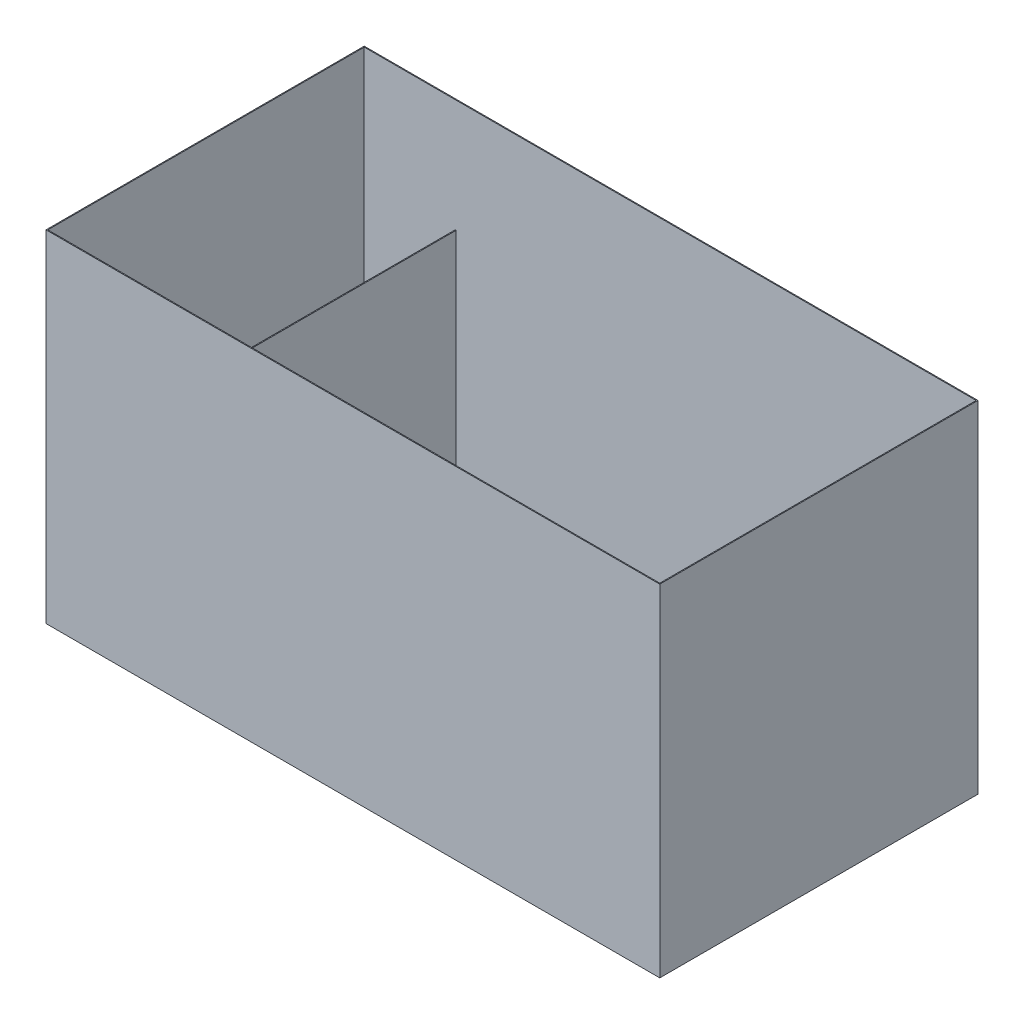
ISO-10303-21;
HEADER;
FILE_DESCRIPTION(('STEP AP214'),'2;1');
FILE_NAME('part.step','',(''),(''),'','','');
FILE_SCHEMA(('AUTOMOTIVE_DESIGN { 1 0 10303 214 1 1 1 1 }'));
ENDSEC;
DATA;
#1=APPLICATION_CONTEXT('core data for automotive mechanical design processes');
#2=APPLICATION_PROTOCOL_DEFINITION('international standard','automotive_design',2000,#1);
#3=PRODUCT_CONTEXT('',#1,'mechanical');
#4=PRODUCT('Part','Part','',(#3));
#5=PRODUCT_RELATED_PRODUCT_CATEGORY('part','',(#4));
#6=PRODUCT_DEFINITION_FORMATION('','',#4);
#7=PRODUCT_DEFINITION_CONTEXT('part definition',#1,'design');
#8=PRODUCT_DEFINITION('design','',#6,#7);
#9=PRODUCT_DEFINITION_SHAPE('','',#8);
#10=(LENGTH_UNIT() NAMED_UNIT(*) SI_UNIT(.MILLI.,.METRE.));
#11=(NAMED_UNIT(*) PLANE_ANGLE_UNIT() SI_UNIT($,.RADIAN.));
#12=(NAMED_UNIT(*) SI_UNIT($,.STERADIAN.) SOLID_ANGLE_UNIT());
#13=UNCERTAINTY_MEASURE_WITH_UNIT(LENGTH_MEASURE(1.E-05),#10,'distance_accuracy_value','');
#14=(GEOMETRIC_REPRESENTATION_CONTEXT(3) GLOBAL_UNCERTAINTY_ASSIGNED_CONTEXT((#13)) GLOBAL_UNIT_ASSIGNED_CONTEXT((#10,
#11,#12)) REPRESENTATION_CONTEXT('',''));
#15=CARTESIAN_POINT('',(0.,0.,0.));
#16=DIRECTION('',(0.,0.,1.));
#17=DIRECTION('',(1.,0.,0.));
#18=AXIS2_PLACEMENT_3D('',#15,#16,#17);
#19=CARTESIAN_POINT('',(252.,100.,-50.));
#20=DIRECTION('',(0.,0.,-1.));
#21=DIRECTION('',(-1.,0.,0.));
#22=AXIS2_PLACEMENT_3D('',#19,#20,#21);
#23=PLANE('',#22);
#24=DIRECTION('',(0.,-1.,0.));
#25=VECTOR('',#24,1.);
#26=CARTESIAN_POINT('',(250.,100.,-50.));
#27=LINE('',#26,#25);
#28=CARTESIAN_POINT('',(250.,550.,-50.));
#29=VERTEX_POINT('',#28);
#30=CARTESIAN_POINT('',(250.,100.,-50.));
#31=VERTEX_POINT('',#30);
#32=EDGE_CURVE('E116',#29,#31,#27,.T.);
#33=ORIENTED_EDGE('',*,*,#32,.T.);
#34=DIRECTION('',(-1.,0.,0.));
#35=VECTOR('',#34,1.);
#36=CARTESIAN_POINT('',(252.,100.,-50.));
#37=LINE('',#36,#35);
#38=CARTESIAN_POINT('',(252.,100.,-50.));
#39=VERTEX_POINT('',#38);
#40=EDGE_CURVE('E12',#39,#31,#37,.T.);
#41=ORIENTED_EDGE('',*,*,#40,.F.);
#42=DIRECTION('',(0.,-1.,0.));
#43=VECTOR('',#42,1.);
#44=CARTESIAN_POINT('',(252.,100.,-50.));
#45=LINE('',#44,#43);
#46=CARTESIAN_POINT('',(252.,550.,-50.));
#47=VERTEX_POINT('',#46);
#48=EDGE_CURVE('E102',#47,#39,#45,.T.);
#49=ORIENTED_EDGE('',*,*,#48,.F.);
#50=DIRECTION('',(-1.,0.,0.));
#51=VECTOR('',#50,1.);
#52=CARTESIAN_POINT('',(252.,550.,-50.));
#53=LINE('',#52,#51);
#54=EDGE_CURVE('E115',#47,#29,#53,.T.);
#55=ORIENTED_EDGE('',*,*,#54,.T.);
#56=EDGE_LOOP('',(#33,#41,#49,#55));
#57=FACE_BOUND('',#56,.T.);
#58=ADVANCED_FACE('F52',(#57),#23,.F.);
#59=CARTESIAN_POINT('',(252.,100.,-50.));
#60=DIRECTION('',(0.,1.,0.));
#61=DIRECTION('',(0.,0.,1.));
#62=AXIS2_PLACEMENT_3D('',#59,#60,#61);
#63=PLANE('',#62);
#64=DIRECTION('',(0.,0.,-1.));
#65=VECTOR('',#64,1.);
#66=CARTESIAN_POINT('',(250.,100.,-50.));
#67=LINE('',#66,#65);
#68=CARTESIAN_POINT('',(250.,100.,-650.));
#69=VERTEX_POINT('',#68);
#70=EDGE_CURVE('E107',#31,#69,#67,.T.);
#71=ORIENTED_EDGE('',*,*,#70,.T.);
#72=DIRECTION('',(-1.,0.,0.));
#73=VECTOR('',#72,1.);
#74=CARTESIAN_POINT('',(252.,100.,-650.));
#75=LINE('',#74,#73);
#76=CARTESIAN_POINT('',(252.,100.,-650.));
#77=VERTEX_POINT('',#76);
#78=EDGE_CURVE('E61',#77,#69,#75,.T.);
#79=ORIENTED_EDGE('',*,*,#78,.F.);
#80=DIRECTION('',(0.,0.,-1.));
#81=VECTOR('',#80,1.);
#82=CARTESIAN_POINT('',(252.,100.,-50.));
#83=LINE('',#82,#81);
#84=EDGE_CURVE('E97',#39,#77,#83,.T.);
#85=ORIENTED_EDGE('',*,*,#84,.F.);
#86=ORIENTED_EDGE('',*,*,#40,.T.);
#87=EDGE_LOOP('',(#71,#79,#85,#86));
#88=FACE_BOUND('',#87,.T.);
#89=ADVANCED_FACE('F110',(#88),#63,.F.);
#90=CARTESIAN_POINT('',(252.,100.,-650.));
#91=DIRECTION('',(0.,0.,1.));
#92=DIRECTION('',(1.,0.,0.));
#93=AXIS2_PLACEMENT_3D('',#90,#91,#92);
#94=PLANE('',#93);
#95=DIRECTION('',(0.,1.,0.));
#96=VECTOR('',#95,1.);
#97=CARTESIAN_POINT('',(250.,100.,-650.));
#98=LINE('',#97,#96);
#99=CARTESIAN_POINT('',(250.,550.,-650.));
#100=VERTEX_POINT('',#99);
#101=EDGE_CURVE('E88',#69,#100,#98,.T.);
#102=ORIENTED_EDGE('',*,*,#101,.T.);
#103=DIRECTION('',(-1.,0.,0.));
#104=VECTOR('',#103,1.);
#105=CARTESIAN_POINT('',(252.,550.,-650.));
#106=LINE('',#105,#104);
#107=CARTESIAN_POINT('',(252.,550.,-650.));
#108=VERTEX_POINT('',#107);
#109=EDGE_CURVE('E108',#108,#100,#106,.T.);
#110=ORIENTED_EDGE('',*,*,#109,.F.);
#111=DIRECTION('',(0.,1.,0.));
#112=VECTOR('',#111,1.);
#113=CARTESIAN_POINT('',(252.,100.,-650.));
#114=LINE('',#113,#112);
#115=EDGE_CURVE('E105',#77,#108,#114,.T.);
#116=ORIENTED_EDGE('',*,*,#115,.F.);
#117=ORIENTED_EDGE('',*,*,#78,.T.);
#118=EDGE_LOOP('',(#102,#110,#116,#117));
#119=FACE_BOUND('',#118,.T.);
#120=ADVANCED_FACE('F109',(#119),#94,.F.);
#121=CARTESIAN_POINT('',(252.,550.,-50.));
#122=DIRECTION('',(0.,-1.,0.));
#123=DIRECTION('',(0.,0.,-1.));
#124=AXIS2_PLACEMENT_3D('',#121,#122,#123);
#125=PLANE('',#124);
#126=DIRECTION('',(0.,0.,1.));
#127=VECTOR('',#126,1.);
#128=CARTESIAN_POINT('',(250.,550.,-50.));
#129=LINE('',#128,#127);
#130=EDGE_CURVE('E95',#100,#29,#129,.T.);
#131=ORIENTED_EDGE('',*,*,#130,.T.);
#132=ORIENTED_EDGE('',*,*,#54,.F.);
#133=DIRECTION('',(0.,0.,1.));
#134=VECTOR('',#133,1.);
#135=CARTESIAN_POINT('',(252.,550.,-50.));
#136=LINE('',#135,#134);
#137=EDGE_CURVE('E66',#108,#47,#136,.T.);
#138=ORIENTED_EDGE('',*,*,#137,.F.);
#139=ORIENTED_EDGE('',*,*,#109,.T.);
#140=EDGE_LOOP('',(#131,#132,#138,#139));
#141=FACE_BOUND('',#140,.T.);
#142=ADVANCED_FACE('F125',(#141),#125,.F.);
#143=CARTESIAN_POINT('',(252.,0.,0.));
#144=DIRECTION('',(-1.,0.,0.));
#145=DIRECTION('',(0.,0.,1.));
#146=AXIS2_PLACEMENT_3D('',#143,#144,#145);
#147=PLANE('',#146);
#148=ORIENTED_EDGE('',*,*,#48,.T.);
#149=ORIENTED_EDGE('',*,*,#84,.T.);
#150=ORIENTED_EDGE('',*,*,#115,.T.);
#151=ORIENTED_EDGE('',*,*,#137,.T.);
#152=EDGE_LOOP('',(#148,#149,#150,#151));
#153=FACE_BOUND('',#152,.T.);
#154=ADVANCED_FACE('F99',(#153),#147,.F.);
#155=CARTESIAN_POINT('',(250.,0.,0.));
#156=DIRECTION('',(-1.,0.,0.));
#157=DIRECTION('',(0.,0.,1.));
#158=AXIS2_PLACEMENT_3D('',#155,#156,#157);
#159=PLANE('',#158);
#160=ORIENTED_EDGE('',*,*,#32,.F.);
#161=ORIENTED_EDGE('',*,*,#130,.F.);
#162=ORIENTED_EDGE('',*,*,#101,.F.);
#163=ORIENTED_EDGE('',*,*,#70,.F.);
#164=EDGE_LOOP('',(#160,#161,#162,#163));
#165=FACE_BOUND('',#164,.T.);
#166=ADVANCED_FACE('F127',(#165),#159,.T.);
#167=CLOSED_SHELL('',(#58,#89,#120,#142,#154,#166));
#168=MANIFOLD_SOLID_BREP('B2',#167);
#169=CARTESIAN_POINT('',(0.,750.,0.));
#170=DIRECTION('',(0.,-1.,0.));
#171=DIRECTION('',(0.,0.,-1.));
#172=AXIS2_PLACEMENT_3D('',#169,#170,#171);
#173=PLANE('',#172);
#174=DIRECTION('',(0.,0.,1.));
#175=VECTOR('',#174,1.);
#176=CARTESIAN_POINT('',(0.,750.,0.));
#177=LINE('',#176,#175);
#178=CARTESIAN_POINT('',(0.,750.,-700.));
#179=VERTEX_POINT('',#178);
#180=CARTESIAN_POINT('',(0.,750.,0.));
#181=VERTEX_POINT('',#180);
#182=EDGE_CURVE('E285',#179,#181,#177,.T.);
#183=ORIENTED_EDGE('',*,*,#182,.T.);
#184=DIRECTION('',(1.,0.,0.));
#185=VECTOR('',#184,1.);
#186=CARTESIAN_POINT('',(0.,750.,0.));
#187=LINE('',#186,#185);
#188=CARTESIAN_POINT('',(1350.,750.,0.));
#189=VERTEX_POINT('',#188);
#190=EDGE_CURVE('E228',#181,#189,#187,.T.);
#191=ORIENTED_EDGE('',*,*,#190,.T.);
#192=DIRECTION('',(0.,0.,-1.));
#193=VECTOR('',#192,1.);
#194=CARTESIAN_POINT('',(1350.,750.,0.));
#195=LINE('',#194,#193);
#196=CARTESIAN_POINT('',(1350.,750.,-700.));
#197=VERTEX_POINT('',#196);
#198=EDGE_CURVE('E290',#189,#197,#195,.T.);
#199=ORIENTED_EDGE('',*,*,#198,.T.);
#200=DIRECTION('',(-1.,0.,0.));
#201=VECTOR('',#200,1.);
#202=CARTESIAN_POINT('',(0.,750.,-700.));
#203=LINE('',#202,#201);
#204=EDGE_CURVE('E203',#197,#179,#203,.T.);
#205=ORIENTED_EDGE('',*,*,#204,.T.);
#206=EDGE_LOOP('',(#183,#191,#199,#205));
#207=FACE_BOUND('',#206,.T.);
#208=DIRECTION('',(0.,0.,1.));
#209=VECTOR('',#208,1.);
#210=CARTESIAN_POINT('',(2.,750.,0.));
#211=LINE('',#210,#209);
#212=CARTESIAN_POINT('',(2.,750.,-698.));
#213=VERTEX_POINT('',#212);
#214=CARTESIAN_POINT('',(2.,750.,-2.));
#215=VERTEX_POINT('',#214);
#216=EDGE_CURVE('E273',#213,#215,#211,.T.);
#217=ORIENTED_EDGE('',*,*,#216,.F.);
#218=DIRECTION('',(-1.,0.,0.));
#219=VECTOR('',#218,1.);
#220=CARTESIAN_POINT('',(0.,750.,-698.));
#221=LINE('',#220,#219);
#222=CARTESIAN_POINT('',(1348.,750.,-698.));
#223=VERTEX_POINT('',#222);
#224=EDGE_CURVE('E284',#223,#213,#221,.T.);
#225=ORIENTED_EDGE('',*,*,#224,.F.);
#226=DIRECTION('',(0.,0.,-1.));
#227=VECTOR('',#226,1.);
#228=CARTESIAN_POINT('',(1348.,750.,0.));
#229=LINE('',#228,#227);
#230=CARTESIAN_POINT('',(1348.,750.,-2.));
#231=VERTEX_POINT('',#230);
#232=EDGE_CURVE('E281',#231,#223,#229,.T.);
#233=ORIENTED_EDGE('',*,*,#232,.F.);
#234=DIRECTION('',(1.,0.,0.));
#235=VECTOR('',#234,1.);
#236=CARTESIAN_POINT('',(0.,750.,-2.));
#237=LINE('',#236,#235);
#238=EDGE_CURVE('E266',#215,#231,#237,.T.);
#239=ORIENTED_EDGE('',*,*,#238,.F.);
#240=EDGE_LOOP('',(#217,#225,#233,#239));
#241=FACE_BOUND('',#240,.T.);
#242=ADVANCED_FACE('F179',(#207,#241),#173,.F.);
#243=CARTESIAN_POINT('',(0.,750.,0.));
#244=DIRECTION('',(1.,0.,0.));
#245=DIRECTION('',(0.,0.,-1.));
#246=AXIS2_PLACEMENT_3D('',#243,#244,#245);
#247=PLANE('',#246);
#248=DIRECTION('',(0.,0.,1.));
#249=VECTOR('',#248,1.);
#250=CARTESIAN_POINT('',(0.,0.,0.));
#251=LINE('',#250,#249);
#252=CARTESIAN_POINT('',(0.,0.,-700.));
#253=VERTEX_POINT('',#252);
#254=CARTESIAN_POINT('',(0.,0.,0.));
#255=VERTEX_POINT('',#254);
#256=EDGE_CURVE('E295',#253,#255,#251,.T.);
#257=ORIENTED_EDGE('',*,*,#256,.T.);
#258=DIRECTION('',(0.,-1.,0.));
#259=VECTOR('',#258,1.);
#260=CARTESIAN_POINT('',(0.,750.,0.));
#261=LINE('',#260,#259);
#262=EDGE_CURVE('E51',#181,#255,#261,.T.);
#263=ORIENTED_EDGE('',*,*,#262,.F.);
#264=ORIENTED_EDGE('',*,*,#182,.F.);
#265=DIRECTION('',(0.,-1.,0.));
#266=VECTOR('',#265,1.);
#267=CARTESIAN_POINT('',(0.,750.,-700.));
#268=LINE('',#267,#266);
#269=EDGE_CURVE('E292',#179,#253,#268,.T.);
#270=ORIENTED_EDGE('',*,*,#269,.T.);
#271=EDGE_LOOP('',(#257,#263,#264,#270));
#272=FACE_BOUND('',#271,.T.);
#273=ADVANCED_FACE('F176',(#272),#247,.F.);
#274=CARTESIAN_POINT('',(0.,750.,0.));
#275=DIRECTION('',(0.,0.,-1.));
#276=DIRECTION('',(-1.,0.,0.));
#277=AXIS2_PLACEMENT_3D('',#274,#275,#276);
#278=PLANE('',#277);
#279=DIRECTION('',(1.,0.,0.));
#280=VECTOR('',#279,1.);
#281=CARTESIAN_POINT('',(0.,0.,0.));
#282=LINE('',#281,#280);
#283=CARTESIAN_POINT('',(1350.,0.,0.));
#284=VERTEX_POINT('',#283);
#285=EDGE_CURVE('E293',#255,#284,#282,.T.);
#286=ORIENTED_EDGE('',*,*,#285,.T.);
#287=DIRECTION('',(0.,-1.,0.));
#288=VECTOR('',#287,1.);
#289=CARTESIAN_POINT('',(1350.,750.,0.));
#290=LINE('',#289,#288);
#291=EDGE_CURVE('E183',#189,#284,#290,.T.);
#292=ORIENTED_EDGE('',*,*,#291,.F.);
#293=ORIENTED_EDGE('',*,*,#190,.F.);
#294=ORIENTED_EDGE('',*,*,#262,.T.);
#295=EDGE_LOOP('',(#286,#292,#293,#294));
#296=FACE_BOUND('',#295,.T.);
#297=ADVANCED_FACE('F323',(#296),#278,.F.);
#298=CARTESIAN_POINT('',(1350.,750.,0.));
#299=DIRECTION('',(-1.,0.,0.));
#300=DIRECTION('',(0.,0.,1.));
#301=AXIS2_PLACEMENT_3D('',#298,#299,#300);
#302=PLANE('',#301);
#303=DIRECTION('',(0.,0.,-1.));
#304=VECTOR('',#303,1.);
#305=CARTESIAN_POINT('',(1350.,0.,0.));
#306=LINE('',#305,#304);
#307=CARTESIAN_POINT('',(1350.,0.,-700.));
#308=VERTEX_POINT('',#307);
#309=EDGE_CURVE('E297',#284,#308,#306,.T.);
#310=ORIENTED_EDGE('',*,*,#309,.T.);
#311=DIRECTION('',(0.,-1.,0.));
#312=VECTOR('',#311,1.);
#313=CARTESIAN_POINT('',(1350.,750.,-700.));
#314=LINE('',#313,#312);
#315=EDGE_CURVE('E302',#197,#308,#314,.T.);
#316=ORIENTED_EDGE('',*,*,#315,.F.);
#317=ORIENTED_EDGE('',*,*,#198,.F.);
#318=ORIENTED_EDGE('',*,*,#291,.T.);
#319=EDGE_LOOP('',(#310,#316,#317,#318));
#320=FACE_BOUND('',#319,.T.);
#321=ADVANCED_FACE('F308',(#320),#302,.F.);
#322=CARTESIAN_POINT('',(0.,750.,-700.));
#323=DIRECTION('',(0.,0.,1.));
#324=DIRECTION('',(1.,0.,0.));
#325=AXIS2_PLACEMENT_3D('',#322,#323,#324);
#326=PLANE('',#325);
#327=DIRECTION('',(-1.,0.,0.));
#328=VECTOR('',#327,1.);
#329=CARTESIAN_POINT('',(0.,0.,-700.));
#330=LINE('',#329,#328);
#331=EDGE_CURVE('E225',#308,#253,#330,.T.);
#332=ORIENTED_EDGE('',*,*,#331,.T.);
#333=ORIENTED_EDGE('',*,*,#269,.F.);
#334=ORIENTED_EDGE('',*,*,#204,.F.);
#335=ORIENTED_EDGE('',*,*,#315,.T.);
#336=EDGE_LOOP('',(#332,#333,#334,#335));
#337=FACE_BOUND('',#336,.T.);
#338=ADVANCED_FACE('F314',(#337),#326,.F.);
#339=CARTESIAN_POINT('',(0.,0.,0.));
#340=DIRECTION('',(0.,-1.,0.));
#341=DIRECTION('',(0.,0.,-1.));
#342=AXIS2_PLACEMENT_3D('',#339,#340,#341);
#343=PLANE('',#342);
#344=ORIENTED_EDGE('',*,*,#256,.F.);
#345=ORIENTED_EDGE('',*,*,#331,.F.);
#346=ORIENTED_EDGE('',*,*,#309,.F.);
#347=ORIENTED_EDGE('',*,*,#285,.F.);
#348=EDGE_LOOP('',(#344,#345,#346,#347));
#349=FACE_BOUND('',#348,.T.);
#350=ADVANCED_FACE('F309',(#349),#343,.T.);
#351=CARTESIAN_POINT('',(2.,750.,0.));
#352=DIRECTION('',(1.,0.,0.));
#353=DIRECTION('',(0.,0.,-1.));
#354=AXIS2_PLACEMENT_3D('',#351,#352,#353);
#355=PLANE('',#354);
#356=DIRECTION('',(0.,0.,1.));
#357=VECTOR('',#356,1.);
#358=CARTESIAN_POINT('',(2.,2.,0.));
#359=LINE('',#358,#357);
#360=CARTESIAN_POINT('',(2.,2.,-698.));
#361=VERTEX_POINT('',#360);
#362=CARTESIAN_POINT('',(2.,2.,-2.));
#363=VERTEX_POINT('',#362);
#364=EDGE_CURVE('E260',#361,#363,#359,.T.);
#365=ORIENTED_EDGE('',*,*,#364,.F.);
#366=DIRECTION('',(0.,-1.,0.));
#367=VECTOR('',#366,1.);
#368=CARTESIAN_POINT('',(2.,750.,-698.));
#369=LINE('',#368,#367);
#370=EDGE_CURVE('E280',#213,#361,#369,.T.);
#371=ORIENTED_EDGE('',*,*,#370,.F.);
#372=ORIENTED_EDGE('',*,*,#216,.T.);
#373=DIRECTION('',(0.,-1.,0.));
#374=VECTOR('',#373,1.);
#375=CARTESIAN_POINT('',(2.,750.,-2.));
#376=LINE('',#375,#374);
#377=EDGE_CURVE('E267',#215,#363,#376,.T.);
#378=ORIENTED_EDGE('',*,*,#377,.T.);
#379=EDGE_LOOP('',(#365,#371,#372,#378));
#380=FACE_BOUND('',#379,.T.);
#381=ADVANCED_FACE('F321',(#380),#355,.T.);
#382=CARTESIAN_POINT('',(0.,750.,-2.));
#383=DIRECTION('',(0.,0.,-1.));
#384=DIRECTION('',(-1.,0.,0.));
#385=AXIS2_PLACEMENT_3D('',#382,#383,#384);
#386=PLANE('',#385);
#387=DIRECTION('',(1.,0.,0.));
#388=VECTOR('',#387,1.);
#389=CARTESIAN_POINT('',(0.,2.,-2.));
#390=LINE('',#389,#388);
#391=CARTESIAN_POINT('',(1348.,2.,-2.));
#392=VERTEX_POINT('',#391);
#393=EDGE_CURVE('E253',#363,#392,#390,.T.);
#394=ORIENTED_EDGE('',*,*,#393,.F.);
#395=ORIENTED_EDGE('',*,*,#377,.F.);
#396=ORIENTED_EDGE('',*,*,#238,.T.);
#397=DIRECTION('',(0.,-1.,0.));
#398=VECTOR('',#397,1.);
#399=CARTESIAN_POINT('',(1348.,750.,-2.));
#400=LINE('',#399,#398);
#401=EDGE_CURVE('E263',#231,#392,#400,.T.);
#402=ORIENTED_EDGE('',*,*,#401,.T.);
#403=EDGE_LOOP('',(#394,#395,#396,#402));
#404=FACE_BOUND('',#403,.T.);
#405=ADVANCED_FACE('F262',(#404),#386,.T.);
#406=CARTESIAN_POINT('',(1348.,750.,0.));
#407=DIRECTION('',(-1.,0.,0.));
#408=DIRECTION('',(0.,0.,1.));
#409=AXIS2_PLACEMENT_3D('',#406,#407,#408);
#410=PLANE('',#409);
#411=DIRECTION('',(0.,0.,-1.));
#412=VECTOR('',#411,1.);
#413=CARTESIAN_POINT('',(1348.,2.,0.));
#414=LINE('',#413,#412);
#415=CARTESIAN_POINT('',(1348.,2.,-698.));
#416=VERTEX_POINT('',#415);
#417=EDGE_CURVE('E254',#392,#416,#414,.T.);
#418=ORIENTED_EDGE('',*,*,#417,.F.);
#419=ORIENTED_EDGE('',*,*,#401,.F.);
#420=ORIENTED_EDGE('',*,*,#232,.T.);
#421=DIRECTION('',(0.,-1.,0.));
#422=VECTOR('',#421,1.);
#423=CARTESIAN_POINT('',(1348.,750.,-698.));
#424=LINE('',#423,#422);
#425=EDGE_CURVE('E194',#223,#416,#424,.T.);
#426=ORIENTED_EDGE('',*,*,#425,.T.);
#427=EDGE_LOOP('',(#418,#419,#420,#426));
#428=FACE_BOUND('',#427,.T.);
#429=ADVANCED_FACE('F271',(#428),#410,.T.);
#430=CARTESIAN_POINT('',(0.,750.,-698.));
#431=DIRECTION('',(0.,0.,1.));
#432=DIRECTION('',(1.,0.,0.));
#433=AXIS2_PLACEMENT_3D('',#430,#431,#432);
#434=PLANE('',#433);
#435=DIRECTION('',(-1.,0.,0.));
#436=VECTOR('',#435,1.);
#437=CARTESIAN_POINT('',(0.,2.,-698.));
#438=LINE('',#437,#436);
#439=EDGE_CURVE('E275',#416,#361,#438,.T.);
#440=ORIENTED_EDGE('',*,*,#439,.F.);
#441=ORIENTED_EDGE('',*,*,#425,.F.);
#442=ORIENTED_EDGE('',*,*,#224,.T.);
#443=ORIENTED_EDGE('',*,*,#370,.T.);
#444=EDGE_LOOP('',(#440,#441,#442,#443));
#445=FACE_BOUND('',#444,.T.);
#446=ADVANCED_FACE('F333',(#445),#434,.T.);
#447=CARTESIAN_POINT('',(0.,2.,0.));
#448=DIRECTION('',(0.,-1.,0.));
#449=DIRECTION('',(0.,0.,-1.));
#450=AXIS2_PLACEMENT_3D('',#447,#448,#449);
#451=PLANE('',#450);
#452=ORIENTED_EDGE('',*,*,#364,.T.);
#453=ORIENTED_EDGE('',*,*,#393,.T.);
#454=ORIENTED_EDGE('',*,*,#417,.T.);
#455=ORIENTED_EDGE('',*,*,#439,.T.);
#456=EDGE_LOOP('',(#452,#453,#454,#455));
#457=FACE_BOUND('',#456,.T.);
#458=ADVANCED_FACE('F251',(#457),#451,.F.);
#459=CLOSED_SHELL('',(#242,#273,#297,#321,#338,#350,#381,#405,#429,#446,#458));
#460=MANIFOLD_SOLID_BREP('B6',#459);
#461=ADVANCED_BREP_SHAPE_REPRESENTATION('',(#18,#168,#460),#14);
#462=SHAPE_DEFINITION_REPRESENTATION(#9,#461);
ENDSEC;
END-ISO-10303-21;
